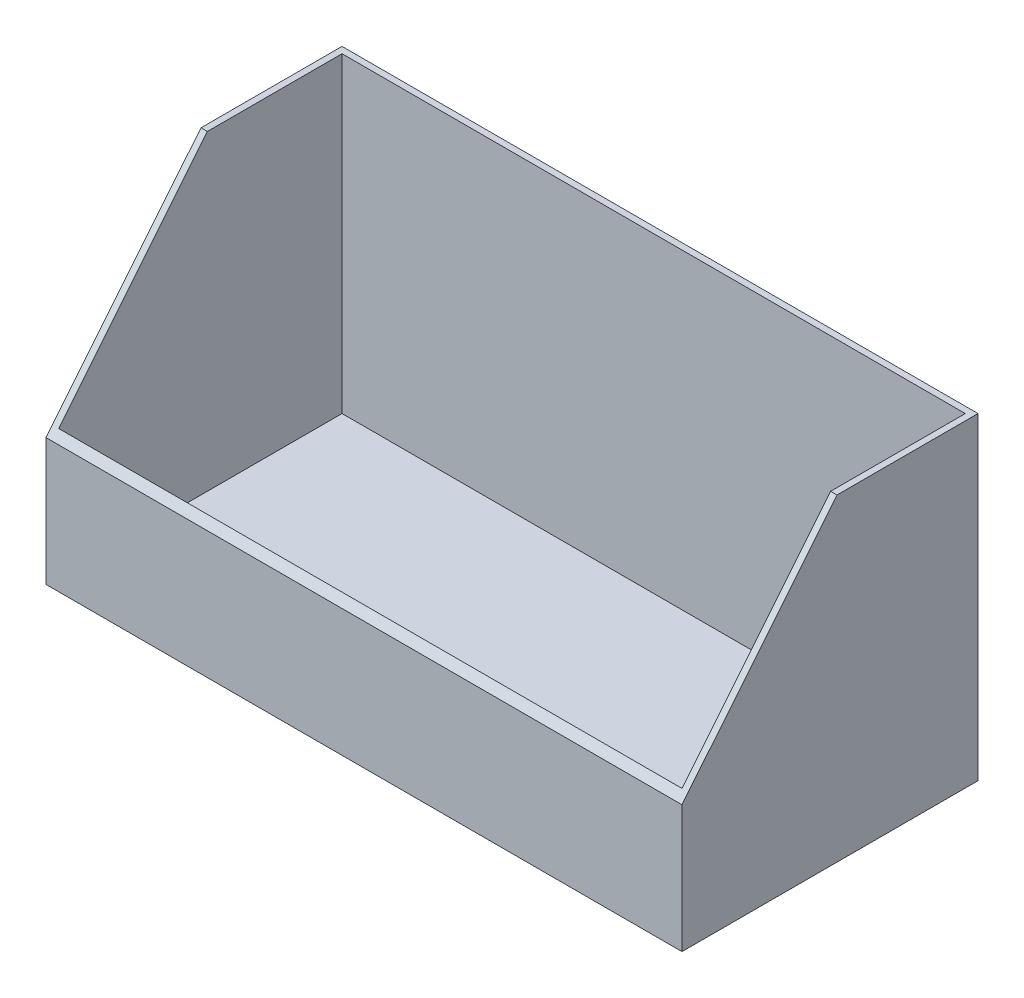
ISO-10303-21;
HEADER;
FILE_DESCRIPTION(('STEP AP214'),'2;1');
FILE_NAME('part.step','',(''),(''),'','','');
FILE_SCHEMA(('AUTOMOTIVE_DESIGN { 1 0 10303 214 1 1 1 1 }'));
ENDSEC;
DATA;
#1=APPLICATION_CONTEXT('core data for automotive mechanical design processes');
#2=APPLICATION_PROTOCOL_DEFINITION('international standard','automotive_design',2000,#1);
#3=PRODUCT_CONTEXT('',#1,'mechanical');
#4=PRODUCT('Part','Part','',(#3));
#5=PRODUCT_RELATED_PRODUCT_CATEGORY('part','',(#4));
#6=PRODUCT_DEFINITION_FORMATION('','',#4);
#7=PRODUCT_DEFINITION_CONTEXT('part definition',#1,'design');
#8=PRODUCT_DEFINITION('design','',#6,#7);
#9=PRODUCT_DEFINITION_SHAPE('','',#8);
#10=(LENGTH_UNIT() NAMED_UNIT(*) SI_UNIT(.MILLI.,.METRE.));
#11=(NAMED_UNIT(*) PLANE_ANGLE_UNIT() SI_UNIT($,.RADIAN.));
#12=(NAMED_UNIT(*) SI_UNIT($,.STERADIAN.) SOLID_ANGLE_UNIT());
#13=UNCERTAINTY_MEASURE_WITH_UNIT(LENGTH_MEASURE(1.E-05),#10,'distance_accuracy_value','');
#14=(GEOMETRIC_REPRESENTATION_CONTEXT(3) GLOBAL_UNCERTAINTY_ASSIGNED_CONTEXT((#13)) GLOBAL_UNIT_ASSIGNED_CONTEXT((#10,
#11,#12)) REPRESENTATION_CONTEXT('',''));
#15=CARTESIAN_POINT('',(0.,0.,0.));
#16=DIRECTION('',(0.,0.,1.));
#17=DIRECTION('',(1.,0.,0.));
#18=AXIS2_PLACEMENT_3D('',#15,#16,#17);
#19=CARTESIAN_POINT('',(127.,216.662,-14.5470064657806));
#20=DIRECTION('',(0.,-1.,0.));
#21=DIRECTION('',(0.,0.,-1.));
#22=AXIS2_PLACEMENT_3D('',#19,#20,#21);
#23=PLANE('',#22);
#24=DIRECTION('',(0.,0.,1.));
#25=VECTOR('',#24,1.);
#26=CARTESIAN_POINT('',(-124.46,216.662,-14.5470064657806));
#27=LINE('',#26,#25);
#28=CARTESIAN_POINT('',(-124.46,216.662,-12.0070064657806));
#29=VERTEX_POINT('',#28);
#30=CARTESIAN_POINT('',(-124.46,216.662,41.7810420592956));
#31=VERTEX_POINT('',#30);
#32=EDGE_CURVE('E174',#29,#31,#27,.T.);
#33=ORIENTED_EDGE('',*,*,#32,.F.);
#34=DIRECTION('',(-1.,0.,0.));
#35=VECTOR('',#34,1.);
#36=CARTESIAN_POINT('',(127.,216.662,-12.0070064657806));
#37=LINE('',#36,#35);
#38=CARTESIAN_POINT('',(124.46,216.662,-12.0070064657806));
#39=VERTEX_POINT('',#38);
#40=EDGE_CURVE('E246',#39,#29,#37,.T.);
#41=ORIENTED_EDGE('',*,*,#40,.F.);
#42=DIRECTION('',(0.,0.,1.));
#43=VECTOR('',#42,1.);
#44=CARTESIAN_POINT('',(124.46,216.662,-14.5470064657806));
#45=LINE('',#44,#43);
#46=CARTESIAN_POINT('',(124.46,216.662,41.7810420592956));
#47=VERTEX_POINT('',#46);
#48=EDGE_CURVE('E254',#39,#47,#45,.T.);
#49=ORIENTED_EDGE('',*,*,#48,.T.);
#50=DIRECTION('',(-1.,0.,0.));
#51=VECTOR('',#50,1.);
#52=CARTESIAN_POINT('',(127.,216.662,41.7810420592956));
#53=LINE('',#52,#51);
#54=CARTESIAN_POINT('',(127.,216.662,41.7810420592956));
#55=VERTEX_POINT('',#54);
#56=EDGE_CURVE('E143',#55,#47,#53,.T.);
#57=ORIENTED_EDGE('',*,*,#56,.F.);
#58=DIRECTION('',(0.,0.,1.));
#59=VECTOR('',#58,1.);
#60=CARTESIAN_POINT('',(127.,216.662,-14.5470064657806));
#61=LINE('',#60,#59);
#62=CARTESIAN_POINT('',(127.,216.662,-14.5470064657806));
#63=VERTEX_POINT('',#62);
#64=EDGE_CURVE('E130',#63,#55,#61,.T.);
#65=ORIENTED_EDGE('',*,*,#64,.F.);
#66=DIRECTION('',(-1.,0.,0.));
#67=VECTOR('',#66,1.);
#68=CARTESIAN_POINT('',(127.,216.662,-14.5470064657806));
#69=LINE('',#68,#67);
#70=CARTESIAN_POINT('',(-127.,216.662,-14.5470064657806));
#71=VERTEX_POINT('',#70);
#72=EDGE_CURVE('E136',#63,#71,#69,.T.);
#73=ORIENTED_EDGE('',*,*,#72,.T.);
#74=DIRECTION('',(0.,0.,1.));
#75=VECTOR('',#74,1.);
#76=CARTESIAN_POINT('',(-127.,216.662,-14.5470064657806));
#77=LINE('',#76,#75);
#78=CARTESIAN_POINT('',(-127.,216.662,41.7810420592956));
#79=VERTEX_POINT('',#78);
#80=EDGE_CURVE('E160',#71,#79,#77,.T.);
#81=ORIENTED_EDGE('',*,*,#80,.T.);
#82=EDGE_CURVE('E165',#31,#79,#53,.T.);
#83=ORIENTED_EDGE('',*,*,#82,.F.);
#84=EDGE_LOOP('',(#33,#41,#49,#57,#65,#73,#81,#83));
#85=FACE_BOUND('',#84,.T.);
#86=ADVANCED_FACE('F64',(#85),#23,.F.);
#87=CARTESIAN_POINT('',(127.,216.662,41.7810420592956));
#88=DIRECTION('',(0.,-0.630511996261592,-0.776179504090531));
#89=DIRECTION('',(0.,0.776179504090531,-0.630511996261592));
#90=AXIS2_PLACEMENT_3D('',#87,#88,#89);
#91=PLANE('',#90);
#92=DIRECTION('',(0.,-0.776179504090531,0.630511996261592));
#93=VECTOR('',#92,1.);
#94=CARTESIAN_POINT('',(-124.46,216.662,41.7810420592956));
#95=LINE('',#94,#93);
#96=CARTESIAN_POINT('',(-124.46,143.588817494479,101.140401501193));
#97=VERTEX_POINT('',#96);
#98=EDGE_CURVE('E179',#31,#97,#95,.T.);
#99=ORIENTED_EDGE('',*,*,#98,.F.);
#100=ORIENTED_EDGE('',*,*,#82,.T.);
#101=DIRECTION('',(0.,-0.776179504090531,0.630511996261592));
#102=VECTOR('',#101,1.);
#103=CARTESIAN_POINT('',(-127.,216.662,41.7810420592956));
#104=LINE('',#103,#102);
#105=CARTESIAN_POINT('',(-127.,140.462,103.680401501193));
#106=VERTEX_POINT('',#105);
#107=EDGE_CURVE('E111',#79,#106,#104,.T.);
#108=ORIENTED_EDGE('',*,*,#107,.T.);
#109=DIRECTION('',(-1.,0.,0.));
#110=VECTOR('',#109,1.);
#111=CARTESIAN_POINT('',(127.,140.462,103.680401501193));
#112=LINE('',#111,#110);
#113=CARTESIAN_POINT('',(127.,140.462,103.680401501193));
#114=VERTEX_POINT('',#113);
#115=EDGE_CURVE('E149',#114,#106,#112,.T.);
#116=ORIENTED_EDGE('',*,*,#115,.F.);
#117=DIRECTION('',(0.,-0.776179504090531,0.630511996261592));
#118=VECTOR('',#117,1.);
#119=CARTESIAN_POINT('',(127.,216.662,41.7810420592956));
#120=LINE('',#119,#118);
#121=EDGE_CURVE('E88',#55,#114,#120,.T.);
#122=ORIENTED_EDGE('',*,*,#121,.F.);
#123=ORIENTED_EDGE('',*,*,#56,.T.);
#124=DIRECTION('',(0.,-0.776179504090531,0.630511996261592));
#125=VECTOR('',#124,1.);
#126=CARTESIAN_POINT('',(124.46,216.662,41.7810420592956));
#127=LINE('',#126,#125);
#128=CARTESIAN_POINT('',(124.46,143.588817494479,101.140401501193));
#129=VERTEX_POINT('',#128);
#130=EDGE_CURVE('E256',#47,#129,#127,.T.);
#131=ORIENTED_EDGE('',*,*,#130,.T.);
#132=DIRECTION('',(-1.,0.,0.));
#133=VECTOR('',#132,1.);
#134=CARTESIAN_POINT('',(127.,143.588817494479,101.140401501193));
#135=LINE('',#134,#133);
#136=EDGE_CURVE('E181',#129,#97,#135,.T.);
#137=ORIENTED_EDGE('',*,*,#136,.T.);
#138=EDGE_LOOP('',(#99,#100,#108,#116,#122,#123,#131,#137));
#139=FACE_BOUND('',#138,.T.);
#140=ADVANCED_FACE('F176',(#139),#91,.F.);
#141=CARTESIAN_POINT('',(127.,140.462,103.680401501193));
#142=DIRECTION('',(0.,0.,-1.));
#143=DIRECTION('',(-1.,0.,0.));
#144=AXIS2_PLACEMENT_3D('',#141,#142,#143);
#145=PLANE('',#144);
#146=DIRECTION('',(0.,-1.,0.));
#147=VECTOR('',#146,1.);
#148=CARTESIAN_POINT('',(-127.,140.462,103.680401501193));
#149=LINE('',#148,#147);
#150=CARTESIAN_POINT('',(-127.,89.662,103.680401501193));
#151=VERTEX_POINT('',#150);
#152=EDGE_CURVE('E153',#106,#151,#149,.T.);
#153=ORIENTED_EDGE('',*,*,#152,.T.);
#154=DIRECTION('',(-1.,0.,0.));
#155=VECTOR('',#154,1.);
#156=CARTESIAN_POINT('',(127.,89.662,103.680401501193));
#157=LINE('',#156,#155);
#158=CARTESIAN_POINT('',(127.,89.662,103.680401501193));
#159=VERTEX_POINT('',#158);
#160=EDGE_CURVE('E12',#159,#151,#157,.T.);
#161=ORIENTED_EDGE('',*,*,#160,.F.);
#162=DIRECTION('',(0.,-1.,0.));
#163=VECTOR('',#162,1.);
#164=CARTESIAN_POINT('',(127.,140.462,103.680401501193));
#165=LINE('',#164,#163);
#166=EDGE_CURVE('E163',#114,#159,#165,.T.);
#167=ORIENTED_EDGE('',*,*,#166,.F.);
#168=ORIENTED_EDGE('',*,*,#115,.T.);
#169=EDGE_LOOP('',(#153,#161,#167,#168));
#170=FACE_BOUND('',#169,.T.);
#171=ADVANCED_FACE('F66',(#170),#145,.F.);
#172=CARTESIAN_POINT('',(127.,89.662,103.680401501193));
#173=DIRECTION('',(0.,1.,0.));
#174=DIRECTION('',(0.,0.,1.));
#175=AXIS2_PLACEMENT_3D('',#172,#173,#174);
#176=PLANE('',#175);
#177=DIRECTION('',(0.,0.,-1.));
#178=VECTOR('',#177,1.);
#179=CARTESIAN_POINT('',(-127.,89.662,103.680401501193));
#180=LINE('',#179,#178);
#181=CARTESIAN_POINT('',(-127.,89.662,-14.5470064657806));
#182=VERTEX_POINT('',#181);
#183=EDGE_CURVE('E156',#151,#182,#180,.T.);
#184=ORIENTED_EDGE('',*,*,#183,.T.);
#185=DIRECTION('',(-1.,0.,0.));
#186=VECTOR('',#185,1.);
#187=CARTESIAN_POINT('',(127.,89.662,-14.5470064657806));
#188=LINE('',#187,#186);
#189=CARTESIAN_POINT('',(127.,89.662,-14.5470064657806));
#190=VERTEX_POINT('',#189);
#191=EDGE_CURVE('E72',#190,#182,#188,.T.);
#192=ORIENTED_EDGE('',*,*,#191,.F.);
#193=DIRECTION('',(0.,0.,-1.));
#194=VECTOR('',#193,1.);
#195=CARTESIAN_POINT('',(127.,89.662,103.680401501193));
#196=LINE('',#195,#194);
#197=EDGE_CURVE('E119',#159,#190,#196,.T.);
#198=ORIENTED_EDGE('',*,*,#197,.F.);
#199=ORIENTED_EDGE('',*,*,#160,.T.);
#200=EDGE_LOOP('',(#184,#192,#198,#199));
#201=FACE_BOUND('',#200,.T.);
#202=ADVANCED_FACE('F195',(#201),#176,.F.);
#203=CARTESIAN_POINT('',(127.,89.662,-14.5470064657806));
#204=DIRECTION('',(0.,0.,1.));
#205=DIRECTION('',(1.,0.,0.));
#206=AXIS2_PLACEMENT_3D('',#203,#204,#205);
#207=PLANE('',#206);
#208=DIRECTION('',(0.,1.,0.));
#209=VECTOR('',#208,1.);
#210=CARTESIAN_POINT('',(-127.,89.662,-14.5470064657806));
#211=LINE('',#210,#209);
#212=EDGE_CURVE('E139',#182,#71,#211,.T.);
#213=ORIENTED_EDGE('',*,*,#212,.T.);
#214=ORIENTED_EDGE('',*,*,#72,.F.);
#215=DIRECTION('',(0.,1.,0.));
#216=VECTOR('',#215,1.);
#217=CARTESIAN_POINT('',(127.,89.662,-14.5470064657806));
#218=LINE('',#217,#216);
#219=EDGE_CURVE('E126',#190,#63,#218,.T.);
#220=ORIENTED_EDGE('',*,*,#219,.F.);
#221=ORIENTED_EDGE('',*,*,#191,.T.);
#222=EDGE_LOOP('',(#213,#214,#220,#221));
#223=FACE_BOUND('',#222,.T.);
#224=ADVANCED_FACE('F137',(#223),#207,.F.);
#225=CARTESIAN_POINT('',(127.,0.,0.));
#226=DIRECTION('',(1.,0.,0.));
#227=DIRECTION('',(0.,0.,-1.));
#228=AXIS2_PLACEMENT_3D('',#225,#226,#227);
#229=PLANE('',#228);
#230=ORIENTED_EDGE('',*,*,#166,.T.);
#231=ORIENTED_EDGE('',*,*,#197,.T.);
#232=ORIENTED_EDGE('',*,*,#219,.T.);
#233=ORIENTED_EDGE('',*,*,#64,.T.);
#234=ORIENTED_EDGE('',*,*,#121,.T.);
#235=EDGE_LOOP('',(#230,#231,#232,#233,#234));
#236=FACE_BOUND('',#235,.T.);
#237=ADVANCED_FACE('F128',(#236),#229,.T.);
#238=CARTESIAN_POINT('',(-127.,0.,0.));
#239=DIRECTION('',(1.,0.,0.));
#240=DIRECTION('',(0.,0.,-1.));
#241=AXIS2_PLACEMENT_3D('',#238,#239,#240);
#242=PLANE('',#241);
#243=ORIENTED_EDGE('',*,*,#152,.F.);
#244=ORIENTED_EDGE('',*,*,#107,.F.);
#245=ORIENTED_EDGE('',*,*,#80,.F.);
#246=ORIENTED_EDGE('',*,*,#212,.F.);
#247=ORIENTED_EDGE('',*,*,#183,.F.);
#248=EDGE_LOOP('',(#243,#244,#245,#246,#247));
#249=FACE_BOUND('',#248,.T.);
#250=ADVANCED_FACE('F168',(#249),#242,.F.);
#251=CARTESIAN_POINT('',(127.,140.462,101.140401501193));
#252=DIRECTION('',(0.,0.,-1.));
#253=DIRECTION('',(-1.,0.,0.));
#254=AXIS2_PLACEMENT_3D('',#251,#252,#253);
#255=PLANE('',#254);
#256=DIRECTION('',(0.,-1.,0.));
#257=VECTOR('',#256,1.);
#258=CARTESIAN_POINT('',(-124.46,140.462,101.140401501193));
#259=LINE('',#258,#257);
#260=CARTESIAN_POINT('',(-124.46,92.202,101.140401501193));
#261=VERTEX_POINT('',#260);
#262=EDGE_CURVE('E233',#97,#261,#259,.T.);
#263=ORIENTED_EDGE('',*,*,#262,.F.);
#264=ORIENTED_EDGE('',*,*,#136,.F.);
#265=DIRECTION('',(0.,-1.,0.));
#266=VECTOR('',#265,1.);
#267=CARTESIAN_POINT('',(124.46,140.462,101.140401501193));
#268=LINE('',#267,#266);
#269=CARTESIAN_POINT('',(124.46,92.202,101.140401501193));
#270=VERTEX_POINT('',#269);
#271=EDGE_CURVE('E79',#129,#270,#268,.T.);
#272=ORIENTED_EDGE('',*,*,#271,.T.);
#273=DIRECTION('',(-1.,0.,0.));
#274=VECTOR('',#273,1.);
#275=CARTESIAN_POINT('',(127.,92.202,101.140401501193));
#276=LINE('',#275,#274);
#277=EDGE_CURVE('E157',#270,#261,#276,.T.);
#278=ORIENTED_EDGE('',*,*,#277,.T.);
#279=EDGE_LOOP('',(#263,#264,#272,#278));
#280=FACE_BOUND('',#279,.T.);
#281=ADVANCED_FACE('F211',(#280),#255,.T.);
#282=CARTESIAN_POINT('',(127.,92.202,103.680401501193));
#283=DIRECTION('',(0.,1.,0.));
#284=DIRECTION('',(0.,0.,1.));
#285=AXIS2_PLACEMENT_3D('',#282,#283,#284);
#286=PLANE('',#285);
#287=DIRECTION('',(0.,0.,-1.));
#288=VECTOR('',#287,1.);
#289=CARTESIAN_POINT('',(-124.46,92.202,103.680401501193));
#290=LINE('',#289,#288);
#291=CARTESIAN_POINT('',(-124.46,92.202,-12.0070064657806));
#292=VERTEX_POINT('',#291);
#293=EDGE_CURVE('E238',#261,#292,#290,.T.);
#294=ORIENTED_EDGE('',*,*,#293,.F.);
#295=ORIENTED_EDGE('',*,*,#277,.F.);
#296=DIRECTION('',(0.,0.,-1.));
#297=VECTOR('',#296,1.);
#298=CARTESIAN_POINT('',(124.46,92.202,103.680401501193));
#299=LINE('',#298,#297);
#300=CARTESIAN_POINT('',(124.46,92.202,-12.0070064657806));
#301=VERTEX_POINT('',#300);
#302=EDGE_CURVE('E186',#270,#301,#299,.T.);
#303=ORIENTED_EDGE('',*,*,#302,.T.);
#304=DIRECTION('',(-1.,0.,0.));
#305=VECTOR('',#304,1.);
#306=CARTESIAN_POINT('',(127.,92.202,-12.0070064657806));
#307=LINE('',#306,#305);
#308=EDGE_CURVE('E242',#301,#292,#307,.T.);
#309=ORIENTED_EDGE('',*,*,#308,.T.);
#310=EDGE_LOOP('',(#294,#295,#303,#309));
#311=FACE_BOUND('',#310,.T.);
#312=ADVANCED_FACE('F223',(#311),#286,.T.);
#313=CARTESIAN_POINT('',(127.,89.662,-12.0070064657806));
#314=DIRECTION('',(0.,0.,1.));
#315=DIRECTION('',(1.,0.,0.));
#316=AXIS2_PLACEMENT_3D('',#313,#314,#315);
#317=PLANE('',#316);
#318=DIRECTION('',(0.,1.,0.));
#319=VECTOR('',#318,1.);
#320=CARTESIAN_POINT('',(-124.46,89.662,-12.0070064657806));
#321=LINE('',#320,#319);
#322=EDGE_CURVE('E188',#292,#29,#321,.T.);
#323=ORIENTED_EDGE('',*,*,#322,.F.);
#324=ORIENTED_EDGE('',*,*,#308,.F.);
#325=DIRECTION('',(0.,1.,0.));
#326=VECTOR('',#325,1.);
#327=CARTESIAN_POINT('',(124.46,89.662,-12.0070064657806));
#328=LINE('',#327,#326);
#329=EDGE_CURVE('E249',#301,#39,#328,.T.);
#330=ORIENTED_EDGE('',*,*,#329,.T.);
#331=ORIENTED_EDGE('',*,*,#40,.T.);
#332=EDGE_LOOP('',(#323,#324,#330,#331));
#333=FACE_BOUND('',#332,.T.);
#334=ADVANCED_FACE('F220',(#333),#317,.T.);
#335=CARTESIAN_POINT('',(124.46,0.,0.));
#336=DIRECTION('',(1.,0.,0.));
#337=DIRECTION('',(0.,0.,-1.));
#338=AXIS2_PLACEMENT_3D('',#335,#336,#337);
#339=PLANE('',#338);
#340=ORIENTED_EDGE('',*,*,#271,.F.);
#341=ORIENTED_EDGE('',*,*,#130,.F.);
#342=ORIENTED_EDGE('',*,*,#48,.F.);
#343=ORIENTED_EDGE('',*,*,#329,.F.);
#344=ORIENTED_EDGE('',*,*,#302,.F.);
#345=EDGE_LOOP('',(#340,#341,#342,#343,#344));
#346=FACE_BOUND('',#345,.T.);
#347=ADVANCED_FACE('F217',(#346),#339,.F.);
#348=CARTESIAN_POINT('',(-124.46,0.,0.));
#349=DIRECTION('',(1.,0.,0.));
#350=DIRECTION('',(0.,0.,-1.));
#351=AXIS2_PLACEMENT_3D('',#348,#349,#350);
#352=PLANE('',#351);
#353=ORIENTED_EDGE('',*,*,#262,.T.);
#354=ORIENTED_EDGE('',*,*,#293,.T.);
#355=ORIENTED_EDGE('',*,*,#322,.T.);
#356=ORIENTED_EDGE('',*,*,#32,.T.);
#357=ORIENTED_EDGE('',*,*,#98,.T.);
#358=EDGE_LOOP('',(#353,#354,#355,#356,#357));
#359=FACE_BOUND('',#358,.T.);
#360=ADVANCED_FACE('F214',(#359),#352,.T.);
#361=CLOSED_SHELL('',(#86,#140,#171,#202,#224,#237,#250,#281,#312,#334,#347,#360));
#362=MANIFOLD_SOLID_BREP('B2',#361);
#363=ADVANCED_BREP_SHAPE_REPRESENTATION('',(#18,#362),#14);
#364=SHAPE_DEFINITION_REPRESENTATION(#9,#363);
ENDSEC;
END-ISO-10303-21;
